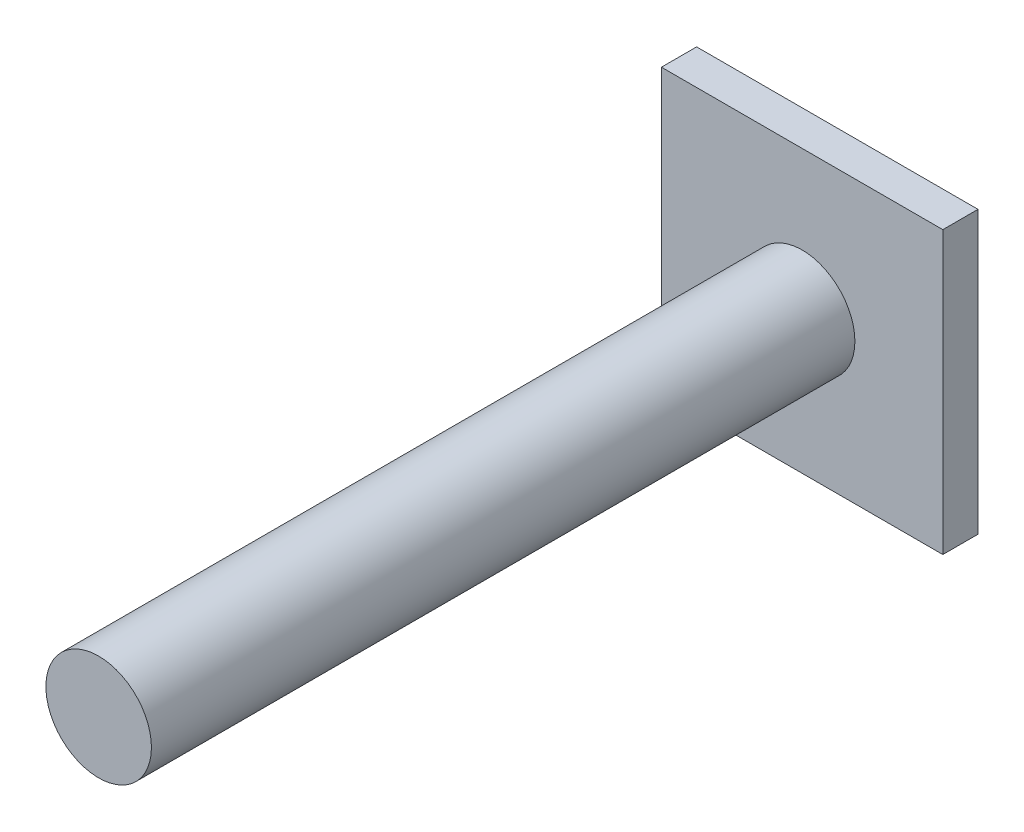
ISO-10303-21;
HEADER;
FILE_DESCRIPTION(('STEP AP214'),'2;1');
FILE_NAME('part.step','',(''),(''),'','','');
FILE_SCHEMA(('AUTOMOTIVE_DESIGN { 1 0 10303 214 1 1 1 1 }'));
ENDSEC;
DATA;
#1=APPLICATION_CONTEXT('core data for automotive mechanical design processes');
#2=APPLICATION_PROTOCOL_DEFINITION('international standard','automotive_design',2000,#1);
#3=PRODUCT_CONTEXT('',#1,'mechanical');
#4=PRODUCT('Part','Part','',(#3));
#5=PRODUCT_RELATED_PRODUCT_CATEGORY('part','',(#4));
#6=PRODUCT_DEFINITION_FORMATION('','',#4);
#7=PRODUCT_DEFINITION_CONTEXT('part definition',#1,'design');
#8=PRODUCT_DEFINITION('design','',#6,#7);
#9=PRODUCT_DEFINITION_SHAPE('','',#8);
#10=(LENGTH_UNIT() NAMED_UNIT(*) SI_UNIT(.MILLI.,.METRE.));
#11=(NAMED_UNIT(*) PLANE_ANGLE_UNIT() SI_UNIT($,.RADIAN.));
#12=(NAMED_UNIT(*) SI_UNIT($,.STERADIAN.) SOLID_ANGLE_UNIT());
#13=UNCERTAINTY_MEASURE_WITH_UNIT(LENGTH_MEASURE(1.E-05),#10,'distance_accuracy_value','');
#14=(GEOMETRIC_REPRESENTATION_CONTEXT(3) GLOBAL_UNCERTAINTY_ASSIGNED_CONTEXT((#13)) GLOBAL_UNIT_ASSIGNED_CONTEXT((#10,
#11,#12)) REPRESENTATION_CONTEXT('',''));
#15=CARTESIAN_POINT('',(0.,0.,0.));
#16=DIRECTION('',(0.,0.,1.));
#17=DIRECTION('',(1.,0.,0.));
#18=AXIS2_PLACEMENT_3D('',#15,#16,#17);
#19=CARTESIAN_POINT('',(0.,0.,5.));
#20=DIRECTION('',(1.,0.,0.));
#21=DIRECTION('',(0.,0.,-1.));
#22=AXIS2_PLACEMENT_3D('',#19,#20,#21);
#23=PLANE('',#22);
#24=DIRECTION('',(0.,-1.,0.));
#25=VECTOR('',#24,1.);
#26=CARTESIAN_POINT('',(0.,0.,0.));
#27=LINE('',#26,#25);
#28=CARTESIAN_POINT('',(0.,40.,0.));
#29=VERTEX_POINT('',#28);
#30=CARTESIAN_POINT('',(0.,0.,0.));
#31=VERTEX_POINT('',#30);
#32=EDGE_CURVE('E99',#29,#31,#27,.T.);
#33=ORIENTED_EDGE('',*,*,#32,.T.);
#34=DIRECTION('',(0.,0.,-1.));
#35=VECTOR('',#34,1.);
#36=CARTESIAN_POINT('',(0.,0.,5.));
#37=LINE('',#36,#35);
#38=CARTESIAN_POINT('',(0.,0.,5.));
#39=VERTEX_POINT('',#38);
#40=EDGE_CURVE('E36',#39,#31,#37,.T.);
#41=ORIENTED_EDGE('',*,*,#40,.F.);
#42=DIRECTION('',(0.,-1.,0.));
#43=VECTOR('',#42,1.);
#44=CARTESIAN_POINT('',(0.,0.,5.));
#45=LINE('',#44,#43);
#46=CARTESIAN_POINT('',(0.,40.,5.));
#47=VERTEX_POINT('',#46);
#48=EDGE_CURVE('E86',#47,#39,#45,.T.);
#49=ORIENTED_EDGE('',*,*,#48,.F.);
#50=DIRECTION('',(0.,0.,-1.));
#51=VECTOR('',#50,1.);
#52=CARTESIAN_POINT('',(0.,40.,5.));
#53=LINE('',#52,#51);
#54=EDGE_CURVE('E95',#47,#29,#53,.T.);
#55=ORIENTED_EDGE('',*,*,#54,.T.);
#56=EDGE_LOOP('',(#33,#41,#49,#55));
#57=FACE_BOUND('',#56,.T.);
#58=ADVANCED_FACE('F33',(#57),#23,.F.);
#59=CARTESIAN_POINT('',(0.,0.,5.));
#60=DIRECTION('',(0.,1.,0.));
#61=DIRECTION('',(0.,0.,1.));
#62=AXIS2_PLACEMENT_3D('',#59,#60,#61);
#63=PLANE('',#62);
#64=DIRECTION('',(1.,0.,0.));
#65=VECTOR('',#64,1.);
#66=CARTESIAN_POINT('',(0.,0.,0.));
#67=LINE('',#66,#65);
#68=CARTESIAN_POINT('',(40.,0.,0.));
#69=VERTEX_POINT('',#68);
#70=EDGE_CURVE('E91',#31,#69,#67,.T.);
#71=ORIENTED_EDGE('',*,*,#70,.T.);
#72=DIRECTION('',(0.,0.,-1.));
#73=VECTOR('',#72,1.);
#74=CARTESIAN_POINT('',(40.,0.,5.));
#75=LINE('',#74,#73);
#76=CARTESIAN_POINT('',(40.,0.,5.));
#77=VERTEX_POINT('',#76);
#78=EDGE_CURVE('E89',#77,#69,#75,.T.);
#79=ORIENTED_EDGE('',*,*,#78,.F.);
#80=DIRECTION('',(1.,0.,0.));
#81=VECTOR('',#80,1.);
#82=CARTESIAN_POINT('',(0.,0.,5.));
#83=LINE('',#82,#81);
#84=EDGE_CURVE('E81',#39,#77,#83,.T.);
#85=ORIENTED_EDGE('',*,*,#84,.F.);
#86=ORIENTED_EDGE('',*,*,#40,.T.);
#87=EDGE_LOOP('',(#71,#79,#85,#86));
#88=FACE_BOUND('',#87,.T.);
#89=ADVANCED_FACE('F90',(#88),#63,.F.);
#90=CARTESIAN_POINT('',(40.,0.,5.));
#91=DIRECTION('',(-1.,0.,0.));
#92=DIRECTION('',(0.,0.,1.));
#93=AXIS2_PLACEMENT_3D('',#90,#91,#92);
#94=PLANE('',#93);
#95=DIRECTION('',(0.,1.,0.));
#96=VECTOR('',#95,1.);
#97=CARTESIAN_POINT('',(40.,0.,0.));
#98=LINE('',#97,#96);
#99=CARTESIAN_POINT('',(40.,40.,0.));
#100=VERTEX_POINT('',#99);
#101=EDGE_CURVE('E67',#69,#100,#98,.T.);
#102=ORIENTED_EDGE('',*,*,#101,.T.);
#103=DIRECTION('',(0.,0.,-1.));
#104=VECTOR('',#103,1.);
#105=CARTESIAN_POINT('',(40.,40.,5.));
#106=LINE('',#105,#104);
#107=CARTESIAN_POINT('',(40.,40.,5.));
#108=VERTEX_POINT('',#107);
#109=EDGE_CURVE('E92',#108,#100,#106,.T.);
#110=ORIENTED_EDGE('',*,*,#109,.F.);
#111=DIRECTION('',(0.,1.,0.));
#112=VECTOR('',#111,1.);
#113=CARTESIAN_POINT('',(40.,0.,5.));
#114=LINE('',#113,#112);
#115=EDGE_CURVE('E84',#77,#108,#114,.T.);
#116=ORIENTED_EDGE('',*,*,#115,.F.);
#117=ORIENTED_EDGE('',*,*,#78,.T.);
#118=EDGE_LOOP('',(#102,#110,#116,#117));
#119=FACE_BOUND('',#118,.T.);
#120=ADVANCED_FACE('F93',(#119),#94,.F.);
#121=CARTESIAN_POINT('',(0.,40.,5.));
#122=DIRECTION('',(0.,-1.,0.));
#123=DIRECTION('',(0.,0.,-1.));
#124=AXIS2_PLACEMENT_3D('',#121,#122,#123);
#125=PLANE('',#124);
#126=DIRECTION('',(-1.,0.,0.));
#127=VECTOR('',#126,1.);
#128=CARTESIAN_POINT('',(0.,40.,0.));
#129=LINE('',#128,#127);
#130=EDGE_CURVE('E73',#100,#29,#129,.T.);
#131=ORIENTED_EDGE('',*,*,#130,.T.);
#132=ORIENTED_EDGE('',*,*,#54,.F.);
#133=DIRECTION('',(-1.,0.,0.));
#134=VECTOR('',#133,1.);
#135=CARTESIAN_POINT('',(0.,40.,5.));
#136=LINE('',#135,#134);
#137=EDGE_CURVE('E50',#108,#47,#136,.T.);
#138=ORIENTED_EDGE('',*,*,#137,.F.);
#139=ORIENTED_EDGE('',*,*,#109,.T.);
#140=EDGE_LOOP('',(#131,#132,#138,#139));
#141=FACE_BOUND('',#140,.T.);
#142=ADVANCED_FACE('F107',(#141),#125,.F.);
#143=CARTESIAN_POINT('',(0.,0.,5.));
#144=DIRECTION('',(0.,0.,-1.));
#145=DIRECTION('',(-1.,0.,0.));
#146=AXIS2_PLACEMENT_3D('',#143,#144,#145);
#147=PLANE('',#146);
#148=CARTESIAN_POINT('',(20.,20.,5.));
#149=DIRECTION('',(0.,0.,1.));
#150=DIRECTION('',(1.,0.,0.));
#151=AXIS2_PLACEMENT_3D('',#148,#149,#150);
#152=CIRCLE('',#151,7.5);
#153=CARTESIAN_POINT('',(27.5,20.,5.));
#154=VERTEX_POINT('',#153);
#155=EDGE_CURVE('E11',#154,#154,#152,.T.);
#156=ORIENTED_EDGE('',*,*,#155,.F.);
#157=EDGE_LOOP('',(#156));
#158=FACE_BOUND('',#157,.T.);
#159=ORIENTED_EDGE('',*,*,#48,.T.);
#160=ORIENTED_EDGE('',*,*,#84,.T.);
#161=ORIENTED_EDGE('',*,*,#115,.T.);
#162=ORIENTED_EDGE('',*,*,#137,.T.);
#163=EDGE_LOOP('',(#159,#160,#161,#162));
#164=FACE_BOUND('',#163,.T.);
#165=ADVANCED_FACE('F82',(#158,#164),#147,.F.);
#166=CARTESIAN_POINT('',(0.,0.,0.));
#167=DIRECTION('',(0.,0.,-1.));
#168=DIRECTION('',(-1.,0.,0.));
#169=AXIS2_PLACEMENT_3D('',#166,#167,#168);
#170=PLANE('',#169);
#171=ORIENTED_EDGE('',*,*,#32,.F.);
#172=ORIENTED_EDGE('',*,*,#130,.F.);
#173=ORIENTED_EDGE('',*,*,#101,.F.);
#174=ORIENTED_EDGE('',*,*,#70,.F.);
#175=EDGE_LOOP('',(#171,#172,#173,#174));
#176=FACE_BOUND('',#175,.T.);
#177=ADVANCED_FACE('F110',(#176),#170,.T.);
#178=CARTESIAN_POINT('',(20.,20.,105.));
#179=DIRECTION('',(0.,0.,-1.));
#180=DIRECTION('',(-1.,0.,0.));
#181=AXIS2_PLACEMENT_3D('',#178,#179,#180);
#182=CYLINDRICAL_SURFACE('',#181,7.5);
#183=CARTESIAN_POINT('',(20.,20.,105.));
#184=DIRECTION('',(0.,0.,1.));
#185=DIRECTION('',(1.,0.,0.));
#186=AXIS2_PLACEMENT_3D('',#183,#184,#185);
#187=CIRCLE('',#186,7.5);
#188=CARTESIAN_POINT('',(27.5,20.,105.));
#189=VERTEX_POINT('',#188);
#190=EDGE_CURVE('E102',#189,#189,#187,.T.);
#191=ORIENTED_EDGE('',*,*,#190,.F.);
#192=EDGE_LOOP('',(#191));
#193=FACE_BOUND('',#192,.T.);
#194=ORIENTED_EDGE('',*,*,#155,.T.);
#195=EDGE_LOOP('',(#194));
#196=FACE_BOUND('',#195,.T.);
#197=ADVANCED_FACE('F118',(#193,#196),#182,.T.);
#198=CARTESIAN_POINT('',(20.,20.,105.));
#199=DIRECTION('',(0.,0.,1.));
#200=DIRECTION('',(1.,0.,0.));
#201=AXIS2_PLACEMENT_3D('',#198,#199,#200);
#202=PLANE('',#201);
#203=ORIENTED_EDGE('',*,*,#190,.T.);
#204=EDGE_LOOP('',(#203));
#205=FACE_BOUND('',#204,.T.);
#206=ADVANCED_FACE('F116',(#205),#202,.T.);
#207=CLOSED_SHELL('',(#58,#89,#120,#142,#165,#177,#197,#206));
#208=MANIFOLD_SOLID_BREP('B2',#207);
#209=ADVANCED_BREP_SHAPE_REPRESENTATION('',(#18,#208),#14);
#210=SHAPE_DEFINITION_REPRESENTATION(#9,#209);
ENDSEC;
END-ISO-10303-21;
